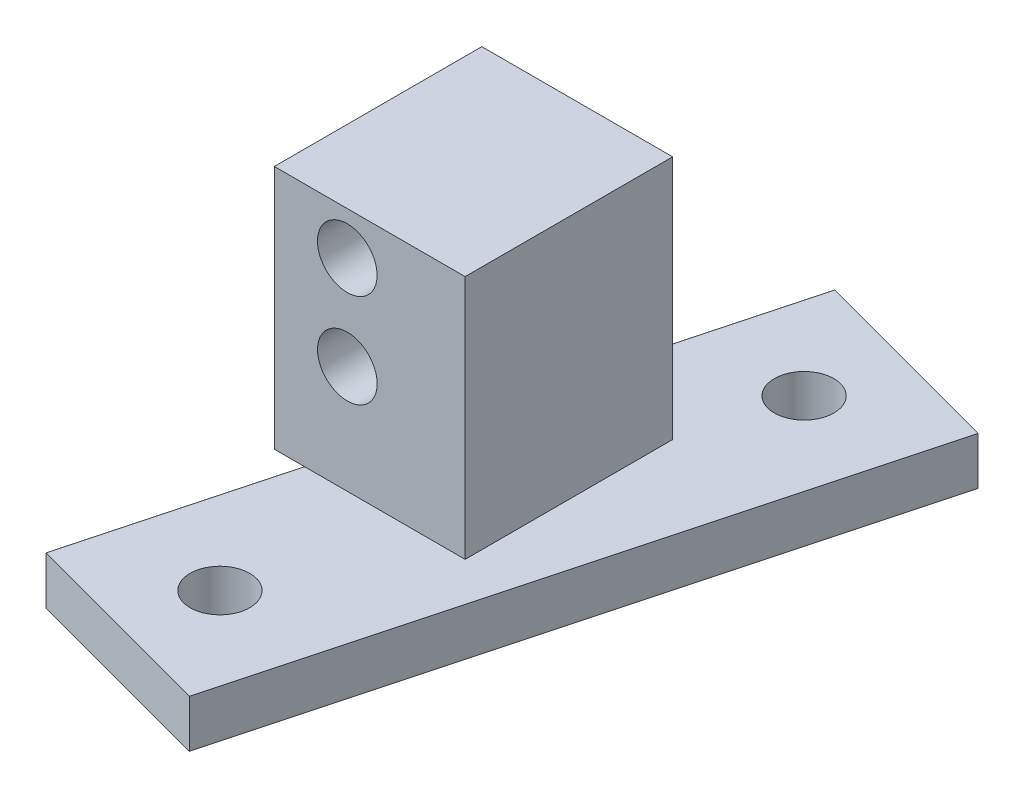
ISO-10303-21;
HEADER;
FILE_DESCRIPTION(('STEP AP214'),'2;1');
FILE_NAME('part.step','',(''),(''),'','','');
FILE_SCHEMA(('AUTOMOTIVE_DESIGN { 1 0 10303 214 1 1 1 1 }'));
ENDSEC;
DATA;
#1=APPLICATION_CONTEXT('core data for automotive mechanical design processes');
#2=APPLICATION_PROTOCOL_DEFINITION('international standard','automotive_design',2000,#1);
#3=PRODUCT_CONTEXT('',#1,'mechanical');
#4=PRODUCT('Part','Part','',(#3));
#5=PRODUCT_RELATED_PRODUCT_CATEGORY('part','',(#4));
#6=PRODUCT_DEFINITION_FORMATION('','',#4);
#7=PRODUCT_DEFINITION_CONTEXT('part definition',#1,'design');
#8=PRODUCT_DEFINITION('design','',#6,#7);
#9=PRODUCT_DEFINITION_SHAPE('','',#8);
#10=(LENGTH_UNIT() NAMED_UNIT(*) SI_UNIT(.MILLI.,.METRE.));
#11=(NAMED_UNIT(*) PLANE_ANGLE_UNIT() SI_UNIT($,.RADIAN.));
#12=(NAMED_UNIT(*) SI_UNIT($,.STERADIAN.) SOLID_ANGLE_UNIT());
#13=UNCERTAINTY_MEASURE_WITH_UNIT(LENGTH_MEASURE(1.E-05),#10,'distance_accuracy_value','');
#14=(GEOMETRIC_REPRESENTATION_CONTEXT(3) GLOBAL_UNCERTAINTY_ASSIGNED_CONTEXT((#13)) GLOBAL_UNIT_ASSIGNED_CONTEXT((#10,
#11,#12)) REPRESENTATION_CONTEXT('',''));
#15=CARTESIAN_POINT('',(0.,0.,0.));
#16=DIRECTION('',(0.,0.,1.));
#17=DIRECTION('',(1.,0.,0.));
#18=AXIS2_PLACEMENT_3D('',#15,#16,#17);
#19=CARTESIAN_POINT('',(0.,102.490000374125,55.1609384331599));
#20=DIRECTION('',(0.,-1.,0.));
#21=DIRECTION('',(0.,0.,-1.));
#22=AXIS2_PLACEMENT_3D('',#19,#20,#21);
#23=PLANE('',#22);
#24=DIRECTION('',(-1.,0.,0.));
#25=VECTOR('',#24,1.);
#26=CARTESIAN_POINT('',(0.,102.490000374125,0.));
#27=LINE('',#26,#25);
#28=CARTESIAN_POINT('',(-102.671163016975,102.490000374125,0.));
#29=VERTEX_POINT('',#28);
#30=CARTESIAN_POINT('',(-111.819894532747,102.490000374125,0.));
#31=VERTEX_POINT('',#30);
#32=EDGE_CURVE('E93',#29,#31,#27,.T.);
#33=ORIENTED_EDGE('',*,*,#32,.F.);
#34=DIRECTION('',(-0.258819045102525,0.,0.965925826289067));
#35=VECTOR('',#34,1.);
#36=CARTESIAN_POINT('',(-96.6636269282966,102.490000374125,-22.4204299112508));
#37=LINE('',#36,#35);
#38=CARTESIAN_POINT('',(-108.592304271318,102.490000374125,22.0979999999998));
#39=VERTEX_POINT('',#38);
#40=EDGE_CURVE('E11',#29,#39,#37,.T.);
#41=ORIENTED_EDGE('',*,*,#40,.T.);
#42=DIRECTION('',(1.,0.,0.));
#43=VECTOR('',#42,1.);
#44=CARTESIAN_POINT('',(0.,102.490000374125,22.0979999999999));
#45=LINE('',#44,#43);
#46=CARTESIAN_POINT('',(-111.819894532747,102.490000374125,22.0979999999998));
#47=VERTEX_POINT('',#46);
#48=EDGE_CURVE('E112',#47,#39,#45,.T.);
#49=ORIENTED_EDGE('',*,*,#48,.F.);
#50=DIRECTION('',(0.,0.,-1.));
#51=VECTOR('',#50,1.);
#52=CARTESIAN_POINT('',(-111.819894532747,102.490000374125,55.1609384331599));
#53=LINE('',#52,#51);
#54=EDGE_CURVE('E110',#47,#31,#53,.T.);
#55=ORIENTED_EDGE('',*,*,#54,.T.);
#56=EDGE_LOOP('',(#33,#41,#49,#55));
#57=FACE_BOUND('',#56,.T.);
#58=ADVANCED_FACE('F47',(#57),#23,.T.);
#59=CARTESIAN_POINT('',(-111.819894532747,0.,55.1609384331599));
#60=DIRECTION('',(-1.,0.,0.));
#61=DIRECTION('',(0.,0.,1.));
#62=AXIS2_PLACEMENT_3D('',#59,#60,#61);
#63=PLANE('',#62);
#64=DIRECTION('',(0.,-1.,0.));
#65=VECTOR('',#64,1.);
#66=CARTESIAN_POINT('',(-111.819894532747,0.,22.0979999999998));
#67=LINE('',#66,#65);
#68=CARTESIAN_POINT('',(-111.819894532747,128.571708482202,22.0979999999998));
#69=VERTEX_POINT('',#68);
#70=EDGE_CURVE('E154',#69,#47,#67,.T.);
#71=ORIENTED_EDGE('',*,*,#70,.F.);
#72=DIRECTION('',(0.,0.,-1.));
#73=VECTOR('',#72,1.);
#74=CARTESIAN_POINT('',(-111.819894532747,128.571708482202,55.1609384331599));
#75=LINE('',#74,#73);
#76=CARTESIAN_POINT('',(-111.819894532747,128.571708482202,0.));
#77=VERTEX_POINT('',#76);
#78=EDGE_CURVE('E116',#69,#77,#75,.T.);
#79=ORIENTED_EDGE('',*,*,#78,.T.);
#80=DIRECTION('',(0.,1.,0.));
#81=VECTOR('',#80,1.);
#82=CARTESIAN_POINT('',(-111.819894532747,0.,0.));
#83=LINE('',#82,#81);
#84=EDGE_CURVE('E98',#31,#77,#83,.T.);
#85=ORIENTED_EDGE('',*,*,#84,.F.);
#86=ORIENTED_EDGE('',*,*,#54,.F.);
#87=EDGE_LOOP('',(#71,#79,#85,#86));
#88=FACE_BOUND('',#87,.T.);
#89=ADVANCED_FACE('F118',(#88),#63,.T.);
#90=CARTESIAN_POINT('',(-91.4998945327474,0.,55.1609384331599));
#91=DIRECTION('',(1.,0.,0.));
#92=DIRECTION('',(0.,0.,-1.));
#93=AXIS2_PLACEMENT_3D('',#90,#91,#92);
#94=PLANE('',#93);
#95=DIRECTION('',(0.,1.,0.));
#96=VECTOR('',#95,1.);
#97=CARTESIAN_POINT('',(-91.4998945327474,0.,22.0979999999998));
#98=LINE('',#97,#96);
#99=CARTESIAN_POINT('',(-91.4998945327474,102.490000374125,22.0979999999998));
#100=VERTEX_POINT('',#99);
#101=CARTESIAN_POINT('',(-91.4998945327474,128.571708482202,22.0979999999998));
#102=VERTEX_POINT('',#101);
#103=EDGE_CURVE('E51',#100,#102,#98,.T.);
#104=ORIENTED_EDGE('',*,*,#103,.F.);
#105=DIRECTION('',(0.,0.,-1.));
#106=VECTOR('',#105,1.);
#107=CARTESIAN_POINT('',(-91.4998945327474,102.490000374125,55.1609384331599));
#108=LINE('',#107,#106);
#109=CARTESIAN_POINT('',(-91.4998945327474,102.490000374125,0.));
#110=VERTEX_POINT('',#109);
#111=EDGE_CURVE('E115',#100,#110,#108,.T.);
#112=ORIENTED_EDGE('',*,*,#111,.T.);
#113=DIRECTION('',(0.,-1.,0.));
#114=VECTOR('',#113,1.);
#115=CARTESIAN_POINT('',(-91.4998945327474,0.,0.));
#116=LINE('',#115,#114);
#117=CARTESIAN_POINT('',(-91.4998945327474,128.571708482202,0.));
#118=VERTEX_POINT('',#117);
#119=EDGE_CURVE('E106',#118,#110,#116,.T.);
#120=ORIENTED_EDGE('',*,*,#119,.F.);
#121=DIRECTION('',(0.,0.,-1.));
#122=VECTOR('',#121,1.);
#123=CARTESIAN_POINT('',(-91.4998945327474,128.571708482202,55.1609384331599));
#124=LINE('',#123,#122);
#125=EDGE_CURVE('E135',#102,#118,#124,.T.);
#126=ORIENTED_EDGE('',*,*,#125,.F.);
#127=EDGE_LOOP('',(#104,#112,#120,#126));
#128=FACE_BOUND('',#127,.T.);
#129=ADVANCED_FACE('F168',(#128),#94,.T.);
#130=CARTESIAN_POINT('',(-104.045206420171,113.999999999999,55.1609384331599));
#131=DIRECTION('',(0.,0.,-1.));
#132=DIRECTION('',(-1.,0.,0.));
#133=AXIS2_PLACEMENT_3D('',#130,#131,#132);
#134=CYLINDRICAL_SURFACE('',#133,3.17499999999998);
#135=CARTESIAN_POINT('',(-104.045206420171,113.999999999999,22.0979999999998));
#136=DIRECTION('',(0.,0.,-1.));
#137=DIRECTION('',(-1.,0.,0.));
#138=AXIS2_PLACEMENT_3D('',#135,#136,#137);
#139=CIRCLE('',#138,3.17499999999998);
#140=CARTESIAN_POINT('',(-107.220206420171,113.999999999999,22.0979999999998));
#141=VERTEX_POINT('',#140);
#142=EDGE_CURVE('E146',#141,#141,#139,.T.);
#143=ORIENTED_EDGE('',*,*,#142,.F.);
#144=EDGE_LOOP('',(#143));
#145=FACE_BOUND('',#144,.T.);
#146=CARTESIAN_POINT('',(-104.045206420171,113.999999999999,0.));
#147=DIRECTION('',(0.,0.,1.));
#148=DIRECTION('',(1.,0.,0.));
#149=AXIS2_PLACEMENT_3D('',#146,#147,#148);
#150=CIRCLE('',#149,3.17499999999998);
#151=CARTESIAN_POINT('',(-100.870206420171,113.999999999999,0.));
#152=VERTEX_POINT('',#151);
#153=EDGE_CURVE('E122',#152,#152,#150,.T.);
#154=ORIENTED_EDGE('',*,*,#153,.F.);
#155=EDGE_LOOP('',(#154));
#156=FACE_BOUND('',#155,.T.);
#157=ADVANCED_FACE('F270',(#145,#156),#134,.F.);
#158=CARTESIAN_POINT('',(-104.050470740245,123.999999999999,55.1609384331599));
#159=DIRECTION('',(0.,0.,-1.));
#160=DIRECTION('',(-1.,0.,0.));
#161=AXIS2_PLACEMENT_3D('',#158,#159,#160);
#162=CYLINDRICAL_SURFACE('',#161,3.17499999999995);
#163=CARTESIAN_POINT('',(-104.050470740245,123.999999999999,22.0979999999998));
#164=DIRECTION('',(0.,0.,-1.));
#165=DIRECTION('',(-1.,0.,0.));
#166=AXIS2_PLACEMENT_3D('',#163,#164,#165);
#167=CIRCLE('',#166,3.17499999999995);
#168=CARTESIAN_POINT('',(-107.225470740245,123.999999999999,22.0979999999998));
#169=VERTEX_POINT('',#168);
#170=EDGE_CURVE('E150',#169,#169,#167,.T.);
#171=ORIENTED_EDGE('',*,*,#170,.F.);
#172=EDGE_LOOP('',(#171));
#173=FACE_BOUND('',#172,.T.);
#174=CARTESIAN_POINT('',(-104.050470740245,123.999999999999,0.));
#175=DIRECTION('',(0.,0.,1.));
#176=DIRECTION('',(1.,0.,0.));
#177=AXIS2_PLACEMENT_3D('',#174,#175,#176);
#178=CIRCLE('',#177,3.17499999999995);
#179=CARTESIAN_POINT('',(-100.875470740246,123.999999999999,0.));
#180=VERTEX_POINT('',#179);
#181=EDGE_CURVE('E128',#180,#180,#178,.T.);
#182=ORIENTED_EDGE('',*,*,#181,.F.);
#183=EDGE_LOOP('',(#182));
#184=FACE_BOUND('',#183,.T.);
#185=ADVANCED_FACE('F272',(#173,#184),#162,.F.);
#186=CARTESIAN_POINT('',(0.,128.571708482202,55.1609384331599));
#187=DIRECTION('',(0.,1.,0.));
#188=DIRECTION('',(0.,0.,1.));
#189=AXIS2_PLACEMENT_3D('',#186,#187,#188);
#190=PLANE('',#189);
#191=DIRECTION('',(-1.,0.,0.));
#192=VECTOR('',#191,1.);
#193=CARTESIAN_POINT('',(0.,128.571708482202,22.0979999999999));
#194=LINE('',#193,#192);
#195=EDGE_CURVE('E57',#102,#69,#194,.T.);
#196=ORIENTED_EDGE('',*,*,#195,.F.);
#197=ORIENTED_EDGE('',*,*,#125,.T.);
#198=DIRECTION('',(1.,0.,0.));
#199=VECTOR('',#198,1.);
#200=CARTESIAN_POINT('',(0.,128.571708482202,0.));
#201=LINE('',#200,#199);
#202=EDGE_CURVE('E121',#77,#118,#201,.T.);
#203=ORIENTED_EDGE('',*,*,#202,.F.);
#204=ORIENTED_EDGE('',*,*,#78,.F.);
#205=EDGE_LOOP('',(#196,#197,#203,#204));
#206=FACE_BOUND('',#205,.T.);
#207=ADVANCED_FACE('F171',(#206),#190,.T.);
#208=CARTESIAN_POINT('',(0.,0.,0.));
#209=DIRECTION('',(0.,0.,1.));
#210=DIRECTION('',(1.,0.,0.));
#211=AXIS2_PLACEMENT_3D('',#208,#209,#210);
#212=PLANE('',#211);
#213=ORIENTED_EDGE('',*,*,#181,.T.);
#214=EDGE_LOOP('',(#213));
#215=FACE_BOUND('',#214,.T.);
#216=ORIENTED_EDGE('',*,*,#153,.T.);
#217=EDGE_LOOP('',(#216));
#218=FACE_BOUND('',#217,.T.);
#219=ORIENTED_EDGE('',*,*,#84,.T.);
#220=ORIENTED_EDGE('',*,*,#202,.T.);
#221=ORIENTED_EDGE('',*,*,#119,.T.);
#222=EDGE_CURVE('E103',#110,#29,#27,.T.);
#223=ORIENTED_EDGE('',*,*,#222,.T.);
#224=ORIENTED_EDGE('',*,*,#32,.T.);
#225=EDGE_LOOP('',(#219,#220,#221,#223,#224));
#226=FACE_BOUND('',#225,.T.);
#227=ADVANCED_FACE('F95',(#215,#218,#226),#212,.F.);
#228=CARTESIAN_POINT('',(-135.800243027641,128.559084459205,22.0979999999998));
#229=DIRECTION('',(0.,0.,-1.));
#230=DIRECTION('',(1.,0.,0.));
#231=AXIS2_PLACEMENT_3D('',#228,#229,#230);
#232=PLANE('',#231);
#233=ORIENTED_EDGE('',*,*,#142,.T.);
#234=EDGE_LOOP('',(#233));
#235=FACE_BOUND('',#234,.T.);
#236=ORIENTED_EDGE('',*,*,#170,.T.);
#237=EDGE_LOOP('',(#236));
#238=FACE_BOUND('',#237,.T.);
#239=ORIENTED_EDGE('',*,*,#70,.T.);
#240=ORIENTED_EDGE('',*,*,#48,.T.);
#241=EDGE_CURVE('E156',#39,#100,#45,.T.);
#242=ORIENTED_EDGE('',*,*,#241,.T.);
#243=ORIENTED_EDGE('',*,*,#103,.T.);
#244=ORIENTED_EDGE('',*,*,#195,.T.);
#245=EDGE_LOOP('',(#239,#240,#242,#243,#244));
#246=FACE_BOUND('',#245,.T.);
#247=ADVANCED_FACE('F49',(#235,#238,#246),#232,.F.);
#248=CARTESIAN_POINT('',(0.,102.490000374125,1.60264754219847E-13));
#249=DIRECTION('',(0.,1.,0.));
#250=DIRECTION('',(0.,0.,1.));
#251=AXIS2_PLACEMENT_3D('',#248,#249,#250);
#252=PLANE('',#251);
#253=CARTESIAN_POINT('',(-101.685366435676,102.490000374125,38.0296342518254));
#254=DIRECTION('',(0.,1.,0.));
#255=DIRECTION('',(0.,0.,1.));
#256=AXIS2_PLACEMENT_3D('',#253,#254,#255);
#257=CIRCLE('',#256,3.175);
#258=CARTESIAN_POINT('',(-101.685366435676,102.490000374125,41.2046342518254));
#259=VERTEX_POINT('',#258);
#260=EDGE_CURVE('E219',#259,#259,#257,.T.);
#261=ORIENTED_EDGE('',*,*,#260,.F.);
#262=EDGE_LOOP('',(#261));
#263=FACE_BOUND('',#262,.T.);
#264=CARTESIAN_POINT('',(-88.5373589444675,102.490000374125,-11.0393977236592));
#265=DIRECTION('',(0.,1.,0.));
#266=DIRECTION('',(0.,0.,1.));
#267=AXIS2_PLACEMENT_3D('',#264,#265,#266);
#268=CIRCLE('',#267,3.175);
#269=CARTESIAN_POINT('',(-88.5373589444675,102.490000374125,-7.86439772365921));
#270=VERTEX_POINT('',#269);
#271=EDGE_CURVE('E227',#270,#270,#268,.T.);
#272=ORIENTED_EDGE('',*,*,#271,.F.);
#273=EDGE_LOOP('',(#272));
#274=FACE_BOUND('',#273,.T.);
#275=ORIENTED_EDGE('',*,*,#241,.F.);
#276=CARTESIAN_POINT('',(-114.413437041428,102.490000374125,43.8227632556535));
#277=VERTEX_POINT('',#276);
#278=EDGE_CURVE('E60',#39,#277,#37,.T.);
#279=ORIENTED_EDGE('',*,*,#278,.T.);
#280=DIRECTION('',(0.965925826289067,0.,0.258819045102524));
#281=VECTOR('',#280,1.);
#282=CARTESIAN_POINT('',(-114.413437041428,102.490000374125,43.8227632556535));
#283=LINE('',#282,#281);
#284=CARTESIAN_POINT('',(-93.5590984518468,102.490000374125,49.410666439417));
#285=VERTEX_POINT('',#284);
#286=EDGE_CURVE('E194',#277,#285,#283,.T.);
#287=ORIENTED_EDGE('',*,*,#286,.T.);
#288=DIRECTION('',(0.258819045102525,0.,-0.965925826289067));
#289=VECTOR('',#288,1.);
#290=CARTESIAN_POINT('',(-93.5590984518468,102.490000374125,49.410666439417));
#291=LINE('',#290,#289);
#292=CARTESIAN_POINT('',(-75.8092883387156,102.490000374125,-16.8325267274873));
#293=VERTEX_POINT('',#292);
#294=EDGE_CURVE('E189',#285,#293,#291,.T.);
#295=ORIENTED_EDGE('',*,*,#294,.T.);
#296=DIRECTION('',(-0.965925826289067,0.,-0.258819045102525));
#297=VECTOR('',#296,1.);
#298=CARTESIAN_POINT('',(-75.8092883387156,102.490000374125,-16.8325267274873));
#299=LINE('',#298,#297);
#300=CARTESIAN_POINT('',(-96.6636269282966,102.490000374125,-22.4204299112508));
#301=VERTEX_POINT('',#300);
#302=EDGE_CURVE('E200',#293,#301,#299,.T.);
#303=ORIENTED_EDGE('',*,*,#302,.T.);
#304=EDGE_CURVE('E59',#301,#29,#37,.T.);
#305=ORIENTED_EDGE('',*,*,#304,.T.);
#306=ORIENTED_EDGE('',*,*,#222,.F.);
#307=ORIENTED_EDGE('',*,*,#111,.F.);
#308=EDGE_LOOP('',(#275,#279,#287,#295,#303,#305,#306,#307));
#309=FACE_BOUND('',#308,.T.);
#310=ADVANCED_FACE('F245',(#263,#274,#309),#252,.T.);
#311=CARTESIAN_POINT('',(-75.8092883387156,97.4100003741253,-16.8325267274873));
#312=DIRECTION('',(0.258819045102525,0.,-0.965925826289067));
#313=DIRECTION('',(-0.965925826289067,0.,-0.258819045102525));
#314=AXIS2_PLACEMENT_3D('',#311,#312,#313);
#315=PLANE('',#314);
#316=ORIENTED_EDGE('',*,*,#302,.F.);
#317=DIRECTION('',(0.,1.,0.));
#318=VECTOR('',#317,1.);
#319=CARTESIAN_POINT('',(-75.8092883387156,97.4100003741253,-16.8325267274873));
#320=LINE('',#319,#318);
#321=CARTESIAN_POINT('',(-75.8092883387156,97.4100003741253,-16.8325267274873));
#322=VERTEX_POINT('',#321);
#323=EDGE_CURVE('E145',#322,#293,#320,.T.);
#324=ORIENTED_EDGE('',*,*,#323,.F.);
#325=DIRECTION('',(-0.965925826289067,0.,-0.258819045102525));
#326=VECTOR('',#325,1.);
#327=CARTESIAN_POINT('',(-75.8092883387156,97.4100003741253,-16.8325267274873));
#328=LINE('',#327,#326);
#329=CARTESIAN_POINT('',(-96.6636269282966,97.4100003741253,-22.4204299112508));
#330=VERTEX_POINT('',#329);
#331=EDGE_CURVE('E193',#322,#330,#328,.T.);
#332=ORIENTED_EDGE('',*,*,#331,.T.);
#333=DIRECTION('',(0.,1.,0.));
#334=VECTOR('',#333,1.);
#335=CARTESIAN_POINT('',(-96.6636269282966,97.4100003741253,-22.4204299112508));
#336=LINE('',#335,#334);
#337=EDGE_CURVE('E174',#330,#301,#336,.T.);
#338=ORIENTED_EDGE('',*,*,#337,.T.);
#339=EDGE_LOOP('',(#316,#324,#332,#338));
#340=FACE_BOUND('',#339,.T.);
#341=ADVANCED_FACE('F247',(#340),#315,.T.);
#342=CARTESIAN_POINT('',(-93.5590984518468,97.4100003741251,49.410666439417));
#343=DIRECTION('',(0.965925826289067,0.,0.258819045102525));
#344=DIRECTION('',(0.258819045102525,0.,-0.965925826289067));
#345=AXIS2_PLACEMENT_3D('',#342,#343,#344);
#346=PLANE('',#345);
#347=ORIENTED_EDGE('',*,*,#294,.F.);
#348=DIRECTION('',(0.,1.,0.));
#349=VECTOR('',#348,1.);
#350=CARTESIAN_POINT('',(-93.5590984518468,97.4100003741251,49.410666439417));
#351=LINE('',#350,#349);
#352=CARTESIAN_POINT('',(-93.5590984518468,97.4100003741251,49.410666439417));
#353=VERTEX_POINT('',#352);
#354=EDGE_CURVE('E182',#353,#285,#351,.T.);
#355=ORIENTED_EDGE('',*,*,#354,.F.);
#356=DIRECTION('',(0.258819045102525,0.,-0.965925826289067));
#357=VECTOR('',#356,1.);
#358=CARTESIAN_POINT('',(-93.5590984518468,97.4100003741251,49.410666439417));
#359=LINE('',#358,#357);
#360=EDGE_CURVE('E179',#353,#322,#359,.T.);
#361=ORIENTED_EDGE('',*,*,#360,.T.);
#362=ORIENTED_EDGE('',*,*,#323,.T.);
#363=EDGE_LOOP('',(#347,#355,#361,#362));
#364=FACE_BOUND('',#363,.T.);
#365=ADVANCED_FACE('F254',(#364),#346,.T.);
#366=CARTESIAN_POINT('',(-114.413437041428,97.4100003741251,43.8227632556535));
#367=DIRECTION('',(-0.258819045102524,0.,0.965925826289067));
#368=DIRECTION('',(0.965925826289067,0.,0.258819045102524));
#369=AXIS2_PLACEMENT_3D('',#366,#367,#368);
#370=PLANE('',#369);
#371=ORIENTED_EDGE('',*,*,#286,.F.);
#372=DIRECTION('',(0.,1.,0.));
#373=VECTOR('',#372,1.);
#374=CARTESIAN_POINT('',(-114.413437041428,97.4100003741251,43.8227632556535));
#375=LINE('',#374,#373);
#376=CARTESIAN_POINT('',(-114.413437041428,97.4100003741251,43.8227632556535));
#377=VERTEX_POINT('',#376);
#378=EDGE_CURVE('E178',#377,#277,#375,.T.);
#379=ORIENTED_EDGE('',*,*,#378,.F.);
#380=DIRECTION('',(0.965925826289067,0.,0.258819045102524));
#381=VECTOR('',#380,1.);
#382=CARTESIAN_POINT('',(-114.413437041428,97.4100003741251,43.8227632556535));
#383=LINE('',#382,#381);
#384=EDGE_CURVE('E208',#377,#353,#383,.T.);
#385=ORIENTED_EDGE('',*,*,#384,.T.);
#386=ORIENTED_EDGE('',*,*,#354,.T.);
#387=EDGE_LOOP('',(#371,#379,#385,#386));
#388=FACE_BOUND('',#387,.T.);
#389=ADVANCED_FACE('F285',(#388),#370,.T.);
#390=CARTESIAN_POINT('',(-96.6636269282966,97.4100003741253,-22.4204299112508));
#391=DIRECTION('',(-0.965925826289067,0.,-0.258819045102525));
#392=DIRECTION('',(-0.258819045102525,0.,0.965925826289067));
#393=AXIS2_PLACEMENT_3D('',#390,#391,#392);
#394=PLANE('',#393);
#395=ORIENTED_EDGE('',*,*,#304,.F.);
#396=ORIENTED_EDGE('',*,*,#337,.F.);
#397=DIRECTION('',(-0.258819045102525,0.,0.965925826289067));
#398=VECTOR('',#397,1.);
#399=CARTESIAN_POINT('',(-96.6636269282966,97.4100003741253,-22.4204299112508));
#400=LINE('',#399,#398);
#401=EDGE_CURVE('E212',#330,#377,#400,.T.);
#402=ORIENTED_EDGE('',*,*,#401,.T.);
#403=ORIENTED_EDGE('',*,*,#378,.T.);
#404=ORIENTED_EDGE('',*,*,#278,.F.);
#405=ORIENTED_EDGE('',*,*,#40,.F.);
#406=EDGE_LOOP('',(#395,#396,#402,#403,#404,#405));
#407=FACE_BOUND('',#406,.T.);
#408=ADVANCED_FACE('F282',(#407),#394,.T.);
#409=CARTESIAN_POINT('',(0.,97.4100003741253,1.52565542892852E-13));
#410=DIRECTION('',(0.,1.,0.));
#411=DIRECTION('',(0.,0.,1.));
#412=AXIS2_PLACEMENT_3D('',#409,#410,#411);
#413=PLANE('',#412);
#414=CARTESIAN_POINT('',(-88.5373589444675,97.4100003741252,-11.0393977236592));
#415=DIRECTION('',(0.,1.,0.));
#416=DIRECTION('',(0.,0.,1.));
#417=AXIS2_PLACEMENT_3D('',#414,#415,#416);
#418=CIRCLE('',#417,3.175);
#419=CARTESIAN_POINT('',(-88.5373589444675,97.4100003741252,-7.86439772365921));
#420=VERTEX_POINT('',#419);
#421=EDGE_CURVE('E223',#420,#420,#418,.T.);
#422=ORIENTED_EDGE('',*,*,#421,.T.);
#423=EDGE_LOOP('',(#422));
#424=FACE_BOUND('',#423,.T.);
#425=CARTESIAN_POINT('',(-101.685366435676,97.4100003741252,38.0296342518254));
#426=DIRECTION('',(0.,1.,0.));
#427=DIRECTION('',(0.,0.,1.));
#428=AXIS2_PLACEMENT_3D('',#425,#426,#427);
#429=CIRCLE('',#428,3.175);
#430=CARTESIAN_POINT('',(-101.685366435676,97.4100003741252,41.2046342518254));
#431=VERTEX_POINT('',#430);
#432=EDGE_CURVE('E204',#431,#431,#429,.T.);
#433=ORIENTED_EDGE('',*,*,#432,.T.);
#434=EDGE_LOOP('',(#433));
#435=FACE_BOUND('',#434,.T.);
#436=ORIENTED_EDGE('',*,*,#331,.F.);
#437=ORIENTED_EDGE('',*,*,#360,.F.);
#438=ORIENTED_EDGE('',*,*,#384,.F.);
#439=ORIENTED_EDGE('',*,*,#401,.F.);
#440=EDGE_LOOP('',(#436,#437,#438,#439));
#441=FACE_BOUND('',#440,.T.);
#442=ADVANCED_FACE('F235',(#424,#435,#441),#413,.F.);
#443=CARTESIAN_POINT('',(-101.685366435676,97.4100003741252,38.0296342518254));
#444=DIRECTION('',(0.,1.,0.));
#445=DIRECTION('',(0.,0.,1.));
#446=AXIS2_PLACEMENT_3D('',#443,#444,#445);
#447=CYLINDRICAL_SURFACE('',#446,3.175);
#448=ORIENTED_EDGE('',*,*,#432,.F.);
#449=EDGE_LOOP('',(#448));
#450=FACE_BOUND('',#449,.T.);
#451=ORIENTED_EDGE('',*,*,#260,.T.);
#452=EDGE_LOOP('',(#451));
#453=FACE_BOUND('',#452,.T.);
#454=ADVANCED_FACE('F241',(#450,#453),#447,.F.);
#455=CARTESIAN_POINT('',(-88.5373589444675,97.4100003741252,-11.0393977236592));
#456=DIRECTION('',(0.,1.,0.));
#457=DIRECTION('',(0.,0.,1.));
#458=AXIS2_PLACEMENT_3D('',#455,#456,#457);
#459=CYLINDRICAL_SURFACE('',#458,3.175);
#460=ORIENTED_EDGE('',*,*,#421,.F.);
#461=EDGE_LOOP('',(#460));
#462=FACE_BOUND('',#461,.T.);
#463=ORIENTED_EDGE('',*,*,#271,.T.);
#464=EDGE_LOOP('',(#463));
#465=FACE_BOUND('',#464,.T.);
#466=ADVANCED_FACE('F238',(#462,#465),#459,.F.);
#467=CLOSED_SHELL('',(#58,#89,#129,#157,#185,#207,#227,#247,#310,#341,#365,#389,#408,#442,#454,#466));
#468=MANIFOLD_SOLID_BREP('B2',#467);
#469=ADVANCED_BREP_SHAPE_REPRESENTATION('',(#18,#468),#14);
#470=SHAPE_DEFINITION_REPRESENTATION(#9,#469);
ENDSEC;
END-ISO-10303-21;
